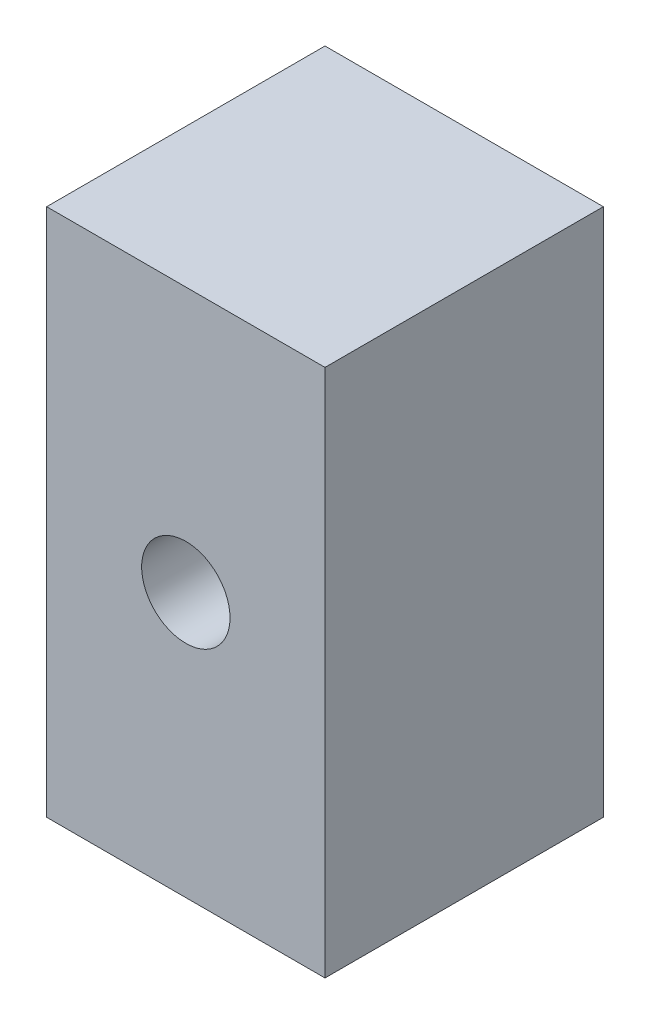
ISO-10303-21;
HEADER;
FILE_DESCRIPTION(('STEP AP214'),'2;1');
FILE_NAME('part.step','',(''),(''),'','','');
FILE_SCHEMA(('AUTOMOTIVE_DESIGN { 1 0 10303 214 1 1 1 1 }'));
ENDSEC;
DATA;
#1=APPLICATION_CONTEXT('core data for automotive mechanical design processes');
#2=APPLICATION_PROTOCOL_DEFINITION('international standard','automotive_design',2000,#1);
#3=PRODUCT_CONTEXT('',#1,'mechanical');
#4=PRODUCT('Part','Part','',(#3));
#5=PRODUCT_RELATED_PRODUCT_CATEGORY('part','',(#4));
#6=PRODUCT_DEFINITION_FORMATION('','',#4);
#7=PRODUCT_DEFINITION_CONTEXT('part definition',#1,'design');
#8=PRODUCT_DEFINITION('design','',#6,#7);
#9=PRODUCT_DEFINITION_SHAPE('','',#8);
#10=(LENGTH_UNIT() NAMED_UNIT(*) SI_UNIT(.MILLI.,.METRE.));
#11=(NAMED_UNIT(*) PLANE_ANGLE_UNIT() SI_UNIT($,.RADIAN.));
#12=(NAMED_UNIT(*) SI_UNIT($,.STERADIAN.) SOLID_ANGLE_UNIT());
#13=UNCERTAINTY_MEASURE_WITH_UNIT(LENGTH_MEASURE(1.E-05),#10,'distance_accuracy_value','');
#14=(GEOMETRIC_REPRESENTATION_CONTEXT(3) GLOBAL_UNCERTAINTY_ASSIGNED_CONTEXT((#13)) GLOBAL_UNIT_ASSIGNED_CONTEXT((#10,
#11,#12)) REPRESENTATION_CONTEXT('',''));
#15=CARTESIAN_POINT('',(0.,0.,0.));
#16=DIRECTION('',(0.,0.,1.));
#17=DIRECTION('',(1.,0.,0.));
#18=AXIS2_PLACEMENT_3D('',#15,#16,#17);
#19=CARTESIAN_POINT('',(0.,38.,0.));
#20=DIRECTION('',(1.,0.,0.));
#21=DIRECTION('',(0.,0.,-1.));
#22=AXIS2_PLACEMENT_3D('',#19,#20,#21);
#23=PLANE('',#22);
#24=DIRECTION('',(0.,0.,1.));
#25=VECTOR('',#24,1.);
#26=CARTESIAN_POINT('',(0.,0.,0.));
#27=LINE('',#26,#25);
#28=CARTESIAN_POINT('',(0.,0.,-20.));
#29=VERTEX_POINT('',#28);
#30=CARTESIAN_POINT('',(0.,0.,0.));
#31=VERTEX_POINT('',#30);
#32=EDGE_CURVE('E104',#29,#31,#27,.T.);
#33=ORIENTED_EDGE('',*,*,#32,.T.);
#34=DIRECTION('',(0.,-1.,0.));
#35=VECTOR('',#34,1.);
#36=CARTESIAN_POINT('',(0.,38.,0.));
#37=LINE('',#36,#35);
#38=CARTESIAN_POINT('',(0.,38.,0.));
#39=VERTEX_POINT('',#38);
#40=EDGE_CURVE('E11',#39,#31,#37,.T.);
#41=ORIENTED_EDGE('',*,*,#40,.F.);
#42=DIRECTION('',(0.,0.,1.));
#43=VECTOR('',#42,1.);
#44=CARTESIAN_POINT('',(0.,38.,0.));
#45=LINE('',#44,#43);
#46=CARTESIAN_POINT('',(0.,38.,-20.));
#47=VERTEX_POINT('',#46);
#48=EDGE_CURVE('E91',#47,#39,#45,.T.);
#49=ORIENTED_EDGE('',*,*,#48,.F.);
#50=DIRECTION('',(0.,-1.,0.));
#51=VECTOR('',#50,1.);
#52=CARTESIAN_POINT('',(0.,38.,-20.));
#53=LINE('',#52,#51);
#54=EDGE_CURVE('E100',#47,#29,#53,.T.);
#55=ORIENTED_EDGE('',*,*,#54,.T.);
#56=EDGE_LOOP('',(#33,#41,#49,#55));
#57=FACE_BOUND('',#56,.T.);
#58=ADVANCED_FACE('F39',(#57),#23,.F.);
#59=CARTESIAN_POINT('',(0.,38.,0.));
#60=DIRECTION('',(0.,0.,-1.));
#61=DIRECTION('',(-1.,0.,0.));
#62=AXIS2_PLACEMENT_3D('',#59,#60,#61);
#63=PLANE('',#62);
#64=CARTESIAN_POINT('',(10.,19.,0.));
#65=DIRECTION('',(0.,0.,1.));
#66=DIRECTION('',(1.,0.,0.));
#67=AXIS2_PLACEMENT_3D('',#64,#65,#66);
#68=CIRCLE('',#67,3.175);
#69=CARTESIAN_POINT('',(13.175,19.,0.));
#70=VERTEX_POINT('',#69);
#71=EDGE_CURVE('E117',#70,#70,#68,.T.);
#72=ORIENTED_EDGE('',*,*,#71,.F.);
#73=EDGE_LOOP('',(#72));
#74=FACE_BOUND('',#73,.T.);
#75=DIRECTION('',(1.,0.,0.));
#76=VECTOR('',#75,1.);
#77=CARTESIAN_POINT('',(0.,0.,0.));
#78=LINE('',#77,#76);
#79=CARTESIAN_POINT('',(20.,0.,0.));
#80=VERTEX_POINT('',#79);
#81=EDGE_CURVE('E95',#31,#80,#78,.T.);
#82=ORIENTED_EDGE('',*,*,#81,.T.);
#83=DIRECTION('',(0.,-1.,0.));
#84=VECTOR('',#83,1.);
#85=CARTESIAN_POINT('',(20.,38.,0.));
#86=LINE('',#85,#84);
#87=CARTESIAN_POINT('',(20.,38.,0.));
#88=VERTEX_POINT('',#87);
#89=EDGE_CURVE('E48',#88,#80,#86,.T.);
#90=ORIENTED_EDGE('',*,*,#89,.F.);
#91=DIRECTION('',(1.,0.,0.));
#92=VECTOR('',#91,1.);
#93=CARTESIAN_POINT('',(0.,38.,0.));
#94=LINE('',#93,#92);
#95=EDGE_CURVE('E86',#39,#88,#94,.T.);
#96=ORIENTED_EDGE('',*,*,#95,.F.);
#97=ORIENTED_EDGE('',*,*,#40,.T.);
#98=EDGE_LOOP('',(#82,#90,#96,#97));
#99=FACE_BOUND('',#98,.T.);
#100=ADVANCED_FACE('F94',(#74,#99),#63,.F.);
#101=CARTESIAN_POINT('',(20.,38.,0.));
#102=DIRECTION('',(-1.,0.,0.));
#103=DIRECTION('',(0.,0.,1.));
#104=AXIS2_PLACEMENT_3D('',#101,#102,#103);
#105=PLANE('',#104);
#106=DIRECTION('',(0.,0.,-1.));
#107=VECTOR('',#106,1.);
#108=CARTESIAN_POINT('',(20.,0.,0.));
#109=LINE('',#108,#107);
#110=CARTESIAN_POINT('',(20.,0.,-20.));
#111=VERTEX_POINT('',#110);
#112=EDGE_CURVE('E73',#80,#111,#109,.T.);
#113=ORIENTED_EDGE('',*,*,#112,.T.);
#114=DIRECTION('',(0.,-1.,0.));
#115=VECTOR('',#114,1.);
#116=CARTESIAN_POINT('',(20.,38.,-20.));
#117=LINE('',#116,#115);
#118=CARTESIAN_POINT('',(20.,38.,-20.));
#119=VERTEX_POINT('',#118);
#120=EDGE_CURVE('E96',#119,#111,#117,.T.);
#121=ORIENTED_EDGE('',*,*,#120,.F.);
#122=DIRECTION('',(0.,0.,-1.));
#123=VECTOR('',#122,1.);
#124=CARTESIAN_POINT('',(20.,38.,0.));
#125=LINE('',#124,#123);
#126=EDGE_CURVE('E89',#88,#119,#125,.T.);
#127=ORIENTED_EDGE('',*,*,#126,.F.);
#128=ORIENTED_EDGE('',*,*,#89,.T.);
#129=EDGE_LOOP('',(#113,#121,#127,#128));
#130=FACE_BOUND('',#129,.T.);
#131=ADVANCED_FACE('F98',(#130),#105,.F.);
#132=CARTESIAN_POINT('',(0.,38.,-20.));
#133=DIRECTION('',(0.,0.,1.));
#134=DIRECTION('',(1.,0.,0.));
#135=AXIS2_PLACEMENT_3D('',#132,#133,#134);
#136=PLANE('',#135);
#137=CARTESIAN_POINT('',(10.,19.,-20.));
#138=DIRECTION('',(0.,0.,1.));
#139=DIRECTION('',(1.,0.,0.));
#140=AXIS2_PLACEMENT_3D('',#137,#138,#139);
#141=CIRCLE('',#140,3.175);
#142=CARTESIAN_POINT('',(13.175,19.,-20.));
#143=VERTEX_POINT('',#142);
#144=EDGE_CURVE('E42',#143,#143,#141,.T.);
#145=ORIENTED_EDGE('',*,*,#144,.T.);
#146=EDGE_LOOP('',(#145));
#147=FACE_BOUND('',#146,.T.);
#148=DIRECTION('',(-1.,0.,0.));
#149=VECTOR('',#148,1.);
#150=CARTESIAN_POINT('',(0.,0.,-20.));
#151=LINE('',#150,#149);
#152=EDGE_CURVE('E79',#111,#29,#151,.T.);
#153=ORIENTED_EDGE('',*,*,#152,.T.);
#154=ORIENTED_EDGE('',*,*,#54,.F.);
#155=DIRECTION('',(-1.,0.,0.));
#156=VECTOR('',#155,1.);
#157=CARTESIAN_POINT('',(0.,38.,-20.));
#158=LINE('',#157,#156);
#159=EDGE_CURVE('E56',#119,#47,#158,.T.);
#160=ORIENTED_EDGE('',*,*,#159,.F.);
#161=ORIENTED_EDGE('',*,*,#120,.T.);
#162=EDGE_LOOP('',(#153,#154,#160,#161));
#163=FACE_BOUND('',#162,.T.);
#164=ADVANCED_FACE('F111',(#147,#163),#136,.F.);
#165=CARTESIAN_POINT('',(0.,38.,0.));
#166=DIRECTION('',(0.,-1.,0.));
#167=DIRECTION('',(0.,0.,-1.));
#168=AXIS2_PLACEMENT_3D('',#165,#166,#167);
#169=PLANE('',#168);
#170=ORIENTED_EDGE('',*,*,#48,.T.);
#171=ORIENTED_EDGE('',*,*,#95,.T.);
#172=ORIENTED_EDGE('',*,*,#126,.T.);
#173=ORIENTED_EDGE('',*,*,#159,.T.);
#174=EDGE_LOOP('',(#170,#171,#172,#173));
#175=FACE_BOUND('',#174,.T.);
#176=ADVANCED_FACE('F87',(#175),#169,.F.);
#177=CARTESIAN_POINT('',(0.,0.,0.));
#178=DIRECTION('',(0.,-1.,0.));
#179=DIRECTION('',(0.,0.,-1.));
#180=AXIS2_PLACEMENT_3D('',#177,#178,#179);
#181=PLANE('',#180);
#182=ORIENTED_EDGE('',*,*,#32,.F.);
#183=ORIENTED_EDGE('',*,*,#152,.F.);
#184=ORIENTED_EDGE('',*,*,#112,.F.);
#185=ORIENTED_EDGE('',*,*,#81,.F.);
#186=EDGE_LOOP('',(#182,#183,#184,#185));
#187=FACE_BOUND('',#186,.T.);
#188=ADVANCED_FACE('F114',(#187),#181,.T.);
#189=CARTESIAN_POINT('',(10.,19.,-38.));
#190=DIRECTION('',(0.,0.,1.));
#191=DIRECTION('',(1.,0.,0.));
#192=AXIS2_PLACEMENT_3D('',#189,#190,#191);
#193=CYLINDRICAL_SURFACE('',#192,3.175);
#194=ORIENTED_EDGE('',*,*,#71,.T.);
#195=EDGE_LOOP('',(#194));
#196=FACE_BOUND('',#195,.T.);
#197=ORIENTED_EDGE('',*,*,#144,.F.);
#198=EDGE_LOOP('',(#197));
#199=FACE_BOUND('',#198,.T.);
#200=ADVANCED_FACE('F125',(#196,#199),#193,.F.);
#201=CLOSED_SHELL('',(#58,#100,#131,#164,#176,#188,#200));
#202=MANIFOLD_SOLID_BREP('B2',#201);
#203=ADVANCED_BREP_SHAPE_REPRESENTATION('',(#18,#202),#14);
#204=SHAPE_DEFINITION_REPRESENTATION(#9,#203);
ENDSEC;
END-ISO-10303-21;
